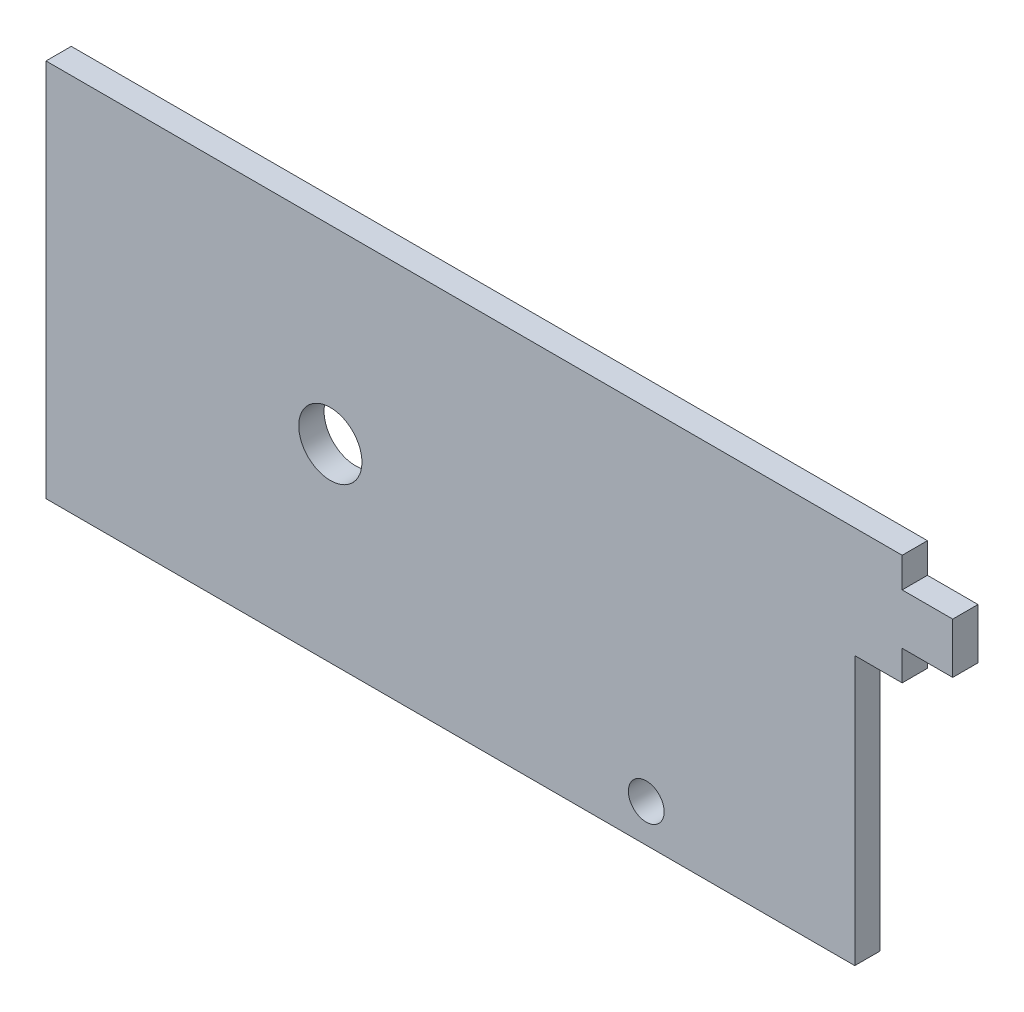
ISO-10303-21;
HEADER;
FILE_DESCRIPTION(('STEP AP214'),'2;1');
FILE_NAME('part.step','',(''),(''),'','','');
FILE_SCHEMA(('AUTOMOTIVE_DESIGN { 1 0 10303 214 1 1 1 1 }'));
ENDSEC;
DATA;
#1=APPLICATION_CONTEXT('core data for automotive mechanical design processes');
#2=APPLICATION_PROTOCOL_DEFINITION('international standard','automotive_design',2000,#1);
#3=PRODUCT_CONTEXT('',#1,'mechanical');
#4=PRODUCT('Part','Part','',(#3));
#5=PRODUCT_RELATED_PRODUCT_CATEGORY('part','',(#4));
#6=PRODUCT_DEFINITION_FORMATION('','',#4);
#7=PRODUCT_DEFINITION_CONTEXT('part definition',#1,'design');
#8=PRODUCT_DEFINITION('design','',#6,#7);
#9=PRODUCT_DEFINITION_SHAPE('','',#8);
#10=(LENGTH_UNIT() NAMED_UNIT(*) SI_UNIT(.MILLI.,.METRE.));
#11=(NAMED_UNIT(*) PLANE_ANGLE_UNIT() SI_UNIT($,.RADIAN.));
#12=(NAMED_UNIT(*) SI_UNIT($,.STERADIAN.) SOLID_ANGLE_UNIT());
#13=UNCERTAINTY_MEASURE_WITH_UNIT(LENGTH_MEASURE(1.E-05),#10,'distance_accuracy_value','');
#14=(GEOMETRIC_REPRESENTATION_CONTEXT(3) GLOBAL_UNCERTAINTY_ASSIGNED_CONTEXT((#13)) GLOBAL_UNIT_ASSIGNED_CONTEXT((#10,
#11,#12)) REPRESENTATION_CONTEXT('',''));
#15=CARTESIAN_POINT('',(0.,0.,0.));
#16=DIRECTION('',(0.,0.,1.));
#17=DIRECTION('',(1.,0.,0.));
#18=AXIS2_PLACEMENT_3D('',#15,#16,#17);
#19=CARTESIAN_POINT('',(0.,0.,4.));
#20=DIRECTION('',(0.,0.,-1.));
#21=DIRECTION('',(-1.,0.,0.));
#22=AXIS2_PLACEMENT_3D('',#19,#20,#21);
#23=PLANE('',#22);
#24=DIRECTION('',(-1.,0.,0.));
#25=VECTOR('',#24,1.);
#26=CARTESIAN_POINT('',(-81.,30.,4.));
#27=LINE('',#26,#25);
#28=CARTESIAN_POINT('',(54.5,30.,4.));
#29=VERTEX_POINT('',#28);
#30=CARTESIAN_POINT('',(-81.,30.,4.));
#31=VERTEX_POINT('',#30);
#32=EDGE_CURVE('E50',#29,#31,#27,.T.);
#33=ORIENTED_EDGE('',*,*,#32,.T.);
#34=DIRECTION('',(0.,-1.,0.));
#35=VECTOR('',#34,1.);
#36=CARTESIAN_POINT('',(-81.,-30.,4.));
#37=LINE('',#36,#35);
#38=CARTESIAN_POINT('',(-81.,-30.,4.));
#39=VERTEX_POINT('',#38);
#40=EDGE_CURVE('E100',#31,#39,#37,.T.);
#41=ORIENTED_EDGE('',*,*,#40,.T.);
#42=DIRECTION('',(1.,0.,0.));
#43=VECTOR('',#42,1.);
#44=CARTESIAN_POINT('',(-81.,-30.,4.));
#45=LINE('',#44,#43);
#46=CARTESIAN_POINT('',(47.,-30.,4.));
#47=VERTEX_POINT('',#46);
#48=EDGE_CURVE('E184',#39,#47,#45,.T.);
#49=ORIENTED_EDGE('',*,*,#48,.T.);
#50=DIRECTION('',(0.,1.,0.));
#51=VECTOR('',#50,1.);
#52=CARTESIAN_POINT('',(47.,12.5,4.));
#53=LINE('',#52,#51);
#54=CARTESIAN_POINT('',(47.,12.5,4.));
#55=VERTEX_POINT('',#54);
#56=EDGE_CURVE('E204',#47,#55,#53,.T.);
#57=ORIENTED_EDGE('',*,*,#56,.T.);
#58=DIRECTION('',(1.,0.,0.));
#59=VECTOR('',#58,1.);
#60=CARTESIAN_POINT('',(54.5,12.5,4.));
#61=LINE('',#60,#59);
#62=CARTESIAN_POINT('',(54.5,12.5,4.));
#63=VERTEX_POINT('',#62);
#64=EDGE_CURVE('E201',#55,#63,#61,.T.);
#65=ORIENTED_EDGE('',*,*,#64,.T.);
#66=DIRECTION('',(0.,1.,0.));
#67=VECTOR('',#66,1.);
#68=CARTESIAN_POINT('',(54.5,17.25,4.));
#69=LINE('',#68,#67);
#70=CARTESIAN_POINT('',(54.5,17.25,4.));
#71=VERTEX_POINT('',#70);
#72=EDGE_CURVE('E203',#63,#71,#69,.T.);
#73=ORIENTED_EDGE('',*,*,#72,.T.);
#74=DIRECTION('',(1.,0.,0.));
#75=VECTOR('',#74,1.);
#76=CARTESIAN_POINT('',(62.5,17.25,4.));
#77=LINE('',#76,#75);
#78=CARTESIAN_POINT('',(62.5,17.25,4.));
#79=VERTEX_POINT('',#78);
#80=EDGE_CURVE('E126',#71,#79,#77,.T.);
#81=ORIENTED_EDGE('',*,*,#80,.T.);
#82=DIRECTION('',(0.,1.,0.));
#83=VECTOR('',#82,1.);
#84=CARTESIAN_POINT('',(62.5,25.25,4.));
#85=LINE('',#84,#83);
#86=CARTESIAN_POINT('',(62.5,25.25,4.));
#87=VERTEX_POINT('',#86);
#88=EDGE_CURVE('E120',#79,#87,#85,.T.);
#89=ORIENTED_EDGE('',*,*,#88,.T.);
#90=DIRECTION('',(-1.,0.,0.));
#91=VECTOR('',#90,1.);
#92=CARTESIAN_POINT('',(54.5,25.25,4.));
#93=LINE('',#92,#91);
#94=CARTESIAN_POINT('',(54.5,25.25,4.));
#95=VERTEX_POINT('',#94);
#96=EDGE_CURVE('E124',#87,#95,#93,.T.);
#97=ORIENTED_EDGE('',*,*,#96,.T.);
#98=DIRECTION('',(0.,1.,0.));
#99=VECTOR('',#98,1.);
#100=CARTESIAN_POINT('',(54.5,30.,4.));
#101=LINE('',#100,#99);
#102=EDGE_CURVE('E140',#95,#29,#101,.T.);
#103=ORIENTED_EDGE('',*,*,#102,.T.);
#104=EDGE_LOOP('',(#33,#41,#49,#57,#65,#73,#81,#89,#97,#103));
#105=FACE_BOUND('',#104,.T.);
#106=CARTESIAN_POINT('',(-36.,0.,4.));
#107=DIRECTION('',(0.,0.,1.));
#108=DIRECTION('',(1.,0.,0.));
#109=AXIS2_PLACEMENT_3D('',#106,#107,#108);
#110=CIRCLE('',#109,5.);
#111=CARTESIAN_POINT('',(-31.,0.,4.));
#112=VERTEX_POINT('',#111);
#113=EDGE_CURVE('E149',#112,#112,#110,.T.);
#114=ORIENTED_EDGE('',*,*,#113,.F.);
#115=EDGE_LOOP('',(#114));
#116=FACE_BOUND('',#115,.T.);
#117=CARTESIAN_POINT('',(14.,-24.,4.));
#118=DIRECTION('',(0.,0.,1.));
#119=DIRECTION('',(1.,0.,0.));
#120=AXIS2_PLACEMENT_3D('',#117,#118,#119);
#121=CIRCLE('',#120,2.83);
#122=CARTESIAN_POINT('',(16.83,-24.,4.));
#123=VERTEX_POINT('',#122);
#124=EDGE_CURVE('E215',#123,#123,#121,.T.);
#125=ORIENTED_EDGE('',*,*,#124,.F.);
#126=EDGE_LOOP('',(#125));
#127=FACE_BOUND('',#126,.T.);
#128=ADVANCED_FACE('F33',(#105,#116,#127),#23,.F.);
#129=CARTESIAN_POINT('',(0.,0.,0.));
#130=DIRECTION('',(0.,0.,-1.));
#131=DIRECTION('',(-1.,0.,0.));
#132=AXIS2_PLACEMENT_3D('',#129,#130,#131);
#133=PLANE('',#132);
#134=CARTESIAN_POINT('',(-36.,0.,0.));
#135=DIRECTION('',(0.,0.,1.));
#136=DIRECTION('',(1.,0.,0.));
#137=AXIS2_PLACEMENT_3D('',#134,#135,#136);
#138=CIRCLE('',#137,5.);
#139=CARTESIAN_POINT('',(-31.,0.,0.));
#140=VERTEX_POINT('',#139);
#141=EDGE_CURVE('E212',#140,#140,#138,.T.);
#142=ORIENTED_EDGE('',*,*,#141,.T.);
#143=EDGE_LOOP('',(#142));
#144=FACE_BOUND('',#143,.T.);
#145=DIRECTION('',(0.,-1.,0.));
#146=VECTOR('',#145,1.);
#147=CARTESIAN_POINT('',(-81.,-30.,0.));
#148=LINE('',#147,#146);
#149=CARTESIAN_POINT('',(-81.,30.,0.));
#150=VERTEX_POINT('',#149);
#151=CARTESIAN_POINT('',(-81.,-30.,0.));
#152=VERTEX_POINT('',#151);
#153=EDGE_CURVE('E146',#150,#152,#148,.T.);
#154=ORIENTED_EDGE('',*,*,#153,.F.);
#155=DIRECTION('',(-1.,0.,0.));
#156=VECTOR('',#155,1.);
#157=CARTESIAN_POINT('',(47.,30.,0.));
#158=LINE('',#157,#156);
#159=CARTESIAN_POINT('',(54.5,30.,0.));
#160=VERTEX_POINT('',#159);
#161=EDGE_CURVE('E162',#160,#150,#158,.T.);
#162=ORIENTED_EDGE('',*,*,#161,.F.);
#163=DIRECTION('',(0.,1.,0.));
#164=VECTOR('',#163,1.);
#165=CARTESIAN_POINT('',(54.5,30.,0.));
#166=LINE('',#165,#164);
#167=CARTESIAN_POINT('',(54.5,25.25,0.));
#168=VERTEX_POINT('',#167);
#169=EDGE_CURVE('E93',#168,#160,#166,.T.);
#170=ORIENTED_EDGE('',*,*,#169,.F.);
#171=DIRECTION('',(-1.,0.,0.));
#172=VECTOR('',#171,1.);
#173=CARTESIAN_POINT('',(54.5,25.25,0.));
#174=LINE('',#173,#172);
#175=CARTESIAN_POINT('',(62.5,25.25,0.));
#176=VERTEX_POINT('',#175);
#177=EDGE_CURVE('E86',#176,#168,#174,.T.);
#178=ORIENTED_EDGE('',*,*,#177,.F.);
#179=DIRECTION('',(0.,1.,0.));
#180=VECTOR('',#179,1.);
#181=CARTESIAN_POINT('',(62.5,25.25,0.));
#182=LINE('',#181,#180);
#183=CARTESIAN_POINT('',(62.5,17.25,0.));
#184=VERTEX_POINT('',#183);
#185=EDGE_CURVE('E134',#184,#176,#182,.T.);
#186=ORIENTED_EDGE('',*,*,#185,.F.);
#187=DIRECTION('',(1.,0.,0.));
#188=VECTOR('',#187,1.);
#189=CARTESIAN_POINT('',(62.5,17.25,0.));
#190=LINE('',#189,#188);
#191=CARTESIAN_POINT('',(54.5,17.25,0.));
#192=VERTEX_POINT('',#191);
#193=EDGE_CURVE('E157',#192,#184,#190,.T.);
#194=ORIENTED_EDGE('',*,*,#193,.F.);
#195=DIRECTION('',(0.,1.,0.));
#196=VECTOR('',#195,1.);
#197=CARTESIAN_POINT('',(54.5,17.25,0.));
#198=LINE('',#197,#196);
#199=CARTESIAN_POINT('',(54.5,12.5,0.));
#200=VERTEX_POINT('',#199);
#201=EDGE_CURVE('E155',#200,#192,#198,.T.);
#202=ORIENTED_EDGE('',*,*,#201,.F.);
#203=DIRECTION('',(1.,0.,0.));
#204=VECTOR('',#203,1.);
#205=CARTESIAN_POINT('',(54.5,12.5,0.));
#206=LINE('',#205,#204);
#207=CARTESIAN_POINT('',(47.,12.5,0.));
#208=VERTEX_POINT('',#207);
#209=EDGE_CURVE('E153',#208,#200,#206,.T.);
#210=ORIENTED_EDGE('',*,*,#209,.F.);
#211=DIRECTION('',(0.,1.,0.));
#212=VECTOR('',#211,1.);
#213=CARTESIAN_POINT('',(47.,12.5,0.));
#214=LINE('',#213,#212);
#215=CARTESIAN_POINT('',(47.,-30.,0.));
#216=VERTEX_POINT('',#215);
#217=EDGE_CURVE('E151',#216,#208,#214,.T.);
#218=ORIENTED_EDGE('',*,*,#217,.F.);
#219=DIRECTION('',(1.,0.,0.));
#220=VECTOR('',#219,1.);
#221=CARTESIAN_POINT('',(-81.,-30.,0.));
#222=LINE('',#221,#220);
#223=EDGE_CURVE('E148',#152,#216,#222,.T.);
#224=ORIENTED_EDGE('',*,*,#223,.F.);
#225=EDGE_LOOP('',(#154,#162,#170,#178,#186,#194,#202,#210,#218,#224));
#226=FACE_BOUND('',#225,.T.);
#227=CARTESIAN_POINT('',(14.,-24.,0.));
#228=DIRECTION('',(0.,0.,1.));
#229=DIRECTION('',(1.,0.,0.));
#230=AXIS2_PLACEMENT_3D('',#227,#228,#229);
#231=CIRCLE('',#230,2.83);
#232=CARTESIAN_POINT('',(16.83,-24.,0.));
#233=VERTEX_POINT('',#232);
#234=EDGE_CURVE('E218',#233,#233,#231,.T.);
#235=ORIENTED_EDGE('',*,*,#234,.T.);
#236=EDGE_LOOP('',(#235));
#237=FACE_BOUND('',#236,.T.);
#238=ADVANCED_FACE('F188',(#144,#226,#237),#133,.T.);
#239=CARTESIAN_POINT('',(-81.,-30.,4.));
#240=DIRECTION('',(1.,0.,0.));
#241=DIRECTION('',(0.,0.,-1.));
#242=AXIS2_PLACEMENT_3D('',#239,#240,#241);
#243=PLANE('',#242);
#244=ORIENTED_EDGE('',*,*,#153,.T.);
#245=DIRECTION('',(0.,0.,-1.));
#246=VECTOR('',#245,1.);
#247=CARTESIAN_POINT('',(-81.,-30.,4.));
#248=LINE('',#247,#246);
#249=EDGE_CURVE('E42',#39,#152,#248,.T.);
#250=ORIENTED_EDGE('',*,*,#249,.F.);
#251=ORIENTED_EDGE('',*,*,#40,.F.);
#252=DIRECTION('',(0.,0.,-1.));
#253=VECTOR('',#252,1.);
#254=CARTESIAN_POINT('',(-81.,30.,4.));
#255=LINE('',#254,#253);
#256=EDGE_CURVE('E11',#31,#150,#255,.T.);
#257=ORIENTED_EDGE('',*,*,#256,.T.);
#258=EDGE_LOOP('',(#244,#250,#251,#257));
#259=FACE_BOUND('',#258,.T.);
#260=ADVANCED_FACE('F35',(#259),#243,.F.);
#261=CARTESIAN_POINT('',(-81.,-30.,4.));
#262=DIRECTION('',(0.,1.,0.));
#263=DIRECTION('',(0.,0.,1.));
#264=AXIS2_PLACEMENT_3D('',#261,#262,#263);
#265=PLANE('',#264);
#266=ORIENTED_EDGE('',*,*,#223,.T.);
#267=DIRECTION('',(0.,0.,-1.));
#268=VECTOR('',#267,1.);
#269=CARTESIAN_POINT('',(47.,-30.,4.));
#270=LINE('',#269,#268);
#271=EDGE_CURVE('E176',#47,#216,#270,.T.);
#272=ORIENTED_EDGE('',*,*,#271,.F.);
#273=ORIENTED_EDGE('',*,*,#48,.F.);
#274=ORIENTED_EDGE('',*,*,#249,.T.);
#275=EDGE_LOOP('',(#266,#272,#273,#274));
#276=FACE_BOUND('',#275,.T.);
#277=ADVANCED_FACE('F182',(#276),#265,.F.);
#278=CARTESIAN_POINT('',(47.,12.5,4.));
#279=DIRECTION('',(-1.,0.,0.));
#280=DIRECTION('',(0.,0.,1.));
#281=AXIS2_PLACEMENT_3D('',#278,#279,#280);
#282=PLANE('',#281);
#283=ORIENTED_EDGE('',*,*,#217,.T.);
#284=DIRECTION('',(0.,0.,-1.));
#285=VECTOR('',#284,1.);
#286=CARTESIAN_POINT('',(47.,12.5,4.));
#287=LINE('',#286,#285);
#288=EDGE_CURVE('E173',#55,#208,#287,.T.);
#289=ORIENTED_EDGE('',*,*,#288,.F.);
#290=ORIENTED_EDGE('',*,*,#56,.F.);
#291=ORIENTED_EDGE('',*,*,#271,.T.);
#292=EDGE_LOOP('',(#283,#289,#290,#291));
#293=FACE_BOUND('',#292,.T.);
#294=ADVANCED_FACE('F195',(#293),#282,.F.);
#295=CARTESIAN_POINT('',(54.5,12.5,4.));
#296=DIRECTION('',(0.,1.,0.));
#297=DIRECTION('',(0.,0.,1.));
#298=AXIS2_PLACEMENT_3D('',#295,#296,#297);
#299=PLANE('',#298);
#300=ORIENTED_EDGE('',*,*,#209,.T.);
#301=DIRECTION('',(0.,0.,-1.));
#302=VECTOR('',#301,1.);
#303=CARTESIAN_POINT('',(54.5,12.5,4.));
#304=LINE('',#303,#302);
#305=EDGE_CURVE('E170',#63,#200,#304,.T.);
#306=ORIENTED_EDGE('',*,*,#305,.F.);
#307=ORIENTED_EDGE('',*,*,#64,.F.);
#308=ORIENTED_EDGE('',*,*,#288,.T.);
#309=EDGE_LOOP('',(#300,#306,#307,#308));
#310=FACE_BOUND('',#309,.T.);
#311=ADVANCED_FACE('F199',(#310),#299,.F.);
#312=CARTESIAN_POINT('',(54.5,17.25,4.));
#313=DIRECTION('',(-1.,0.,0.));
#314=DIRECTION('',(0.,0.,1.));
#315=AXIS2_PLACEMENT_3D('',#312,#313,#314);
#316=PLANE('',#315);
#317=ORIENTED_EDGE('',*,*,#201,.T.);
#318=DIRECTION('',(0.,0.,-1.));
#319=VECTOR('',#318,1.);
#320=CARTESIAN_POINT('',(54.5,17.25,4.));
#321=LINE('',#320,#319);
#322=EDGE_CURVE('E167',#71,#192,#321,.T.);
#323=ORIENTED_EDGE('',*,*,#322,.F.);
#324=ORIENTED_EDGE('',*,*,#72,.F.);
#325=ORIENTED_EDGE('',*,*,#305,.T.);
#326=EDGE_LOOP('',(#317,#323,#324,#325));
#327=FACE_BOUND('',#326,.T.);
#328=ADVANCED_FACE('F251',(#327),#316,.F.);
#329=CARTESIAN_POINT('',(62.5,17.25,4.));
#330=DIRECTION('',(0.,1.,0.));
#331=DIRECTION('',(0.,0.,1.));
#332=AXIS2_PLACEMENT_3D('',#329,#330,#331);
#333=PLANE('',#332);
#334=ORIENTED_EDGE('',*,*,#193,.T.);
#335=DIRECTION('',(0.,0.,-1.));
#336=VECTOR('',#335,1.);
#337=CARTESIAN_POINT('',(62.5,17.25,4.));
#338=LINE('',#337,#336);
#339=EDGE_CURVE('E135',#79,#184,#338,.T.);
#340=ORIENTED_EDGE('',*,*,#339,.F.);
#341=ORIENTED_EDGE('',*,*,#80,.F.);
#342=ORIENTED_EDGE('',*,*,#322,.T.);
#343=EDGE_LOOP('',(#334,#340,#341,#342));
#344=FACE_BOUND('',#343,.T.);
#345=ADVANCED_FACE('F248',(#344),#333,.F.);
#346=CARTESIAN_POINT('',(62.5,25.25,4.));
#347=DIRECTION('',(-1.,0.,0.));
#348=DIRECTION('',(0.,0.,1.));
#349=AXIS2_PLACEMENT_3D('',#346,#347,#348);
#350=PLANE('',#349);
#351=ORIENTED_EDGE('',*,*,#185,.T.);
#352=DIRECTION('',(0.,0.,-1.));
#353=VECTOR('',#352,1.);
#354=CARTESIAN_POINT('',(62.5,25.25,4.));
#355=LINE('',#354,#353);
#356=EDGE_CURVE('E131',#87,#176,#355,.T.);
#357=ORIENTED_EDGE('',*,*,#356,.F.);
#358=ORIENTED_EDGE('',*,*,#88,.F.);
#359=ORIENTED_EDGE('',*,*,#339,.T.);
#360=EDGE_LOOP('',(#351,#357,#358,#359));
#361=FACE_BOUND('',#360,.T.);
#362=ADVANCED_FACE('F132',(#361),#350,.F.);
#363=CARTESIAN_POINT('',(54.5,25.25,4.));
#364=DIRECTION('',(0.,-1.,0.));
#365=DIRECTION('',(0.,0.,-1.));
#366=AXIS2_PLACEMENT_3D('',#363,#364,#365);
#367=PLANE('',#366);
#368=ORIENTED_EDGE('',*,*,#177,.T.);
#369=DIRECTION('',(0.,0.,-1.));
#370=VECTOR('',#369,1.);
#371=CARTESIAN_POINT('',(54.5,25.25,4.));
#372=LINE('',#371,#370);
#373=EDGE_CURVE('E136',#95,#168,#372,.T.);
#374=ORIENTED_EDGE('',*,*,#373,.F.);
#375=ORIENTED_EDGE('',*,*,#96,.F.);
#376=ORIENTED_EDGE('',*,*,#356,.T.);
#377=EDGE_LOOP('',(#368,#374,#375,#376));
#378=FACE_BOUND('',#377,.T.);
#379=ADVANCED_FACE('F138',(#378),#367,.F.);
#380=CARTESIAN_POINT('',(54.5,30.,4.));
#381=DIRECTION('',(-1.,0.,0.));
#382=DIRECTION('',(0.,-1.,0.));
#383=AXIS2_PLACEMENT_3D('',#380,#381,#382);
#384=PLANE('',#383);
#385=ORIENTED_EDGE('',*,*,#169,.T.);
#386=DIRECTION('',(0.,0.,-1.));
#387=VECTOR('',#386,1.);
#388=CARTESIAN_POINT('',(54.5,30.,4.));
#389=LINE('',#388,#387);
#390=EDGE_CURVE('E142',#29,#160,#389,.T.);
#391=ORIENTED_EDGE('',*,*,#390,.F.);
#392=ORIENTED_EDGE('',*,*,#102,.F.);
#393=ORIENTED_EDGE('',*,*,#373,.T.);
#394=EDGE_LOOP('',(#385,#391,#392,#393));
#395=FACE_BOUND('',#394,.T.);
#396=ADVANCED_FACE('F241',(#395),#384,.F.);
#397=CARTESIAN_POINT('',(47.,30.,4.));
#398=DIRECTION('',(0.,-1.,0.));
#399=DIRECTION('',(0.,0.,-1.));
#400=AXIS2_PLACEMENT_3D('',#397,#398,#399);
#401=PLANE('',#400);
#402=ORIENTED_EDGE('',*,*,#161,.T.);
#403=ORIENTED_EDGE('',*,*,#256,.F.);
#404=ORIENTED_EDGE('',*,*,#32,.F.);
#405=ORIENTED_EDGE('',*,*,#390,.T.);
#406=EDGE_LOOP('',(#402,#403,#404,#405));
#407=FACE_BOUND('',#406,.T.);
#408=ADVANCED_FACE('F238',(#407),#401,.F.);
#409=CARTESIAN_POINT('',(-36.,0.,4.));
#410=DIRECTION('',(0.,0.,-1.));
#411=DIRECTION('',(-1.,0.,0.));
#412=AXIS2_PLACEMENT_3D('',#409,#410,#411);
#413=CYLINDRICAL_SURFACE('',#412,5.);
#414=ORIENTED_EDGE('',*,*,#113,.T.);
#415=EDGE_LOOP('',(#414));
#416=FACE_BOUND('',#415,.T.);
#417=ORIENTED_EDGE('',*,*,#141,.F.);
#418=EDGE_LOOP('',(#417));
#419=FACE_BOUND('',#418,.T.);
#420=ADVANCED_FACE('F235',(#416,#419),#413,.F.);
#421=CARTESIAN_POINT('',(14.,-24.,4.));
#422=DIRECTION('',(0.,0.,-1.));
#423=DIRECTION('',(-1.,0.,0.));
#424=AXIS2_PLACEMENT_3D('',#421,#422,#423);
#425=CYLINDRICAL_SURFACE('',#424,2.83);
#426=ORIENTED_EDGE('',*,*,#124,.T.);
#427=EDGE_LOOP('',(#426));
#428=FACE_BOUND('',#427,.T.);
#429=ORIENTED_EDGE('',*,*,#234,.F.);
#430=EDGE_LOOP('',(#429));
#431=FACE_BOUND('',#430,.T.);
#432=ADVANCED_FACE('F224',(#428,#431),#425,.F.);
#433=CLOSED_SHELL('',(#128,#238,#260,#277,#294,#311,#328,#345,#362,#379,#396,#408,#420,#432));
#434=MANIFOLD_SOLID_BREP('B2',#433);
#435=ADVANCED_BREP_SHAPE_REPRESENTATION('',(#18,#434),#14);
#436=SHAPE_DEFINITION_REPRESENTATION(#9,#435);
ENDSEC;
END-ISO-10303-21;
